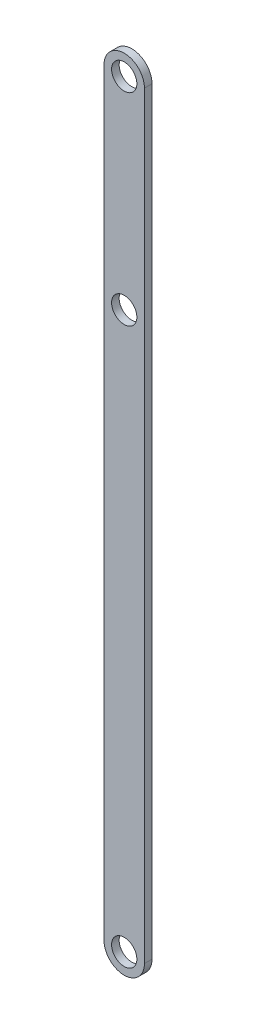
ISO-10303-21;
HEADER;
FILE_DESCRIPTION(('STEP AP214'),'2;1');
FILE_NAME('part.step','',(''),(''),'','','');
FILE_SCHEMA(('AUTOMOTIVE_DESIGN { 1 0 10303 214 1 1 1 1 }'));
ENDSEC;
DATA;
#1=APPLICATION_CONTEXT('core data for automotive mechanical design processes');
#2=APPLICATION_PROTOCOL_DEFINITION('international standard','automotive_design',2000,#1);
#3=PRODUCT_CONTEXT('',#1,'mechanical');
#4=PRODUCT('Part','Part','',(#3));
#5=PRODUCT_RELATED_PRODUCT_CATEGORY('part','',(#4));
#6=PRODUCT_DEFINITION_FORMATION('','',#4);
#7=PRODUCT_DEFINITION_CONTEXT('part definition',#1,'design');
#8=PRODUCT_DEFINITION('design','',#6,#7);
#9=PRODUCT_DEFINITION_SHAPE('','',#8);
#10=(LENGTH_UNIT() NAMED_UNIT(*) SI_UNIT(.MILLI.,.METRE.));
#11=(NAMED_UNIT(*) PLANE_ANGLE_UNIT() SI_UNIT($,.RADIAN.));
#12=(NAMED_UNIT(*) SI_UNIT($,.STERADIAN.) SOLID_ANGLE_UNIT());
#13=UNCERTAINTY_MEASURE_WITH_UNIT(LENGTH_MEASURE(1.E-05),#10,'distance_accuracy_value','');
#14=(GEOMETRIC_REPRESENTATION_CONTEXT(3) GLOBAL_UNCERTAINTY_ASSIGNED_CONTEXT((#13)) GLOBAL_UNIT_ASSIGNED_CONTEXT((#10,
#11,#12)) REPRESENTATION_CONTEXT('',''));
#15=CARTESIAN_POINT('',(0.,0.,0.));
#16=DIRECTION('',(0.,0.,1.));
#17=DIRECTION('',(1.,0.,0.));
#18=AXIS2_PLACEMENT_3D('',#15,#16,#17);
#19=CARTESIAN_POINT('',(0.,-15.,0.3));
#20=DIRECTION('',(0.,0.,1.));
#21=DIRECTION('',(1.,0.,0.));
#22=AXIS2_PLACEMENT_3D('',#19,#20,#21);
#23=PLANE('',#22);
#24=CARTESIAN_POINT('',(0.,-15.,0.3));
#25=DIRECTION('',(0.,0.,1.));
#26=DIRECTION('',(1.,0.,0.));
#27=AXIS2_PLACEMENT_3D('',#24,#25,#26);
#28=CIRCLE('',#27,0.5);
#29=CARTESIAN_POINT('',(0.5,-15.,0.3));
#30=VERTEX_POINT('',#29);
#31=EDGE_CURVE('E115',#30,#30,#28,.T.);
#32=ORIENTED_EDGE('',*,*,#31,.F.);
#33=EDGE_LOOP('',(#32));
#34=FACE_BOUND('',#33,.T.);
#35=CARTESIAN_POINT('',(0.,-15.,0.3));
#36=DIRECTION('',(0.,0.,1.));
#37=DIRECTION('',(1.,0.,0.));
#38=AXIS2_PLACEMENT_3D('',#35,#36,#37);
#39=CIRCLE('',#38,0.800000000000006);
#40=CARTESIAN_POINT('',(-0.800000000000006,-15.,0.3));
#41=VERTEX_POINT('',#40);
#42=CARTESIAN_POINT('',(0.800000000000006,-15.,0.3));
#43=VERTEX_POINT('',#42);
#44=EDGE_CURVE('E85',#41,#43,#39,.T.);
#45=ORIENTED_EDGE('',*,*,#44,.T.);
#46=DIRECTION('',(0.,1.,0.));
#47=VECTOR('',#46,1.);
#48=CARTESIAN_POINT('',(0.800000000000006,-15.,0.3));
#49=LINE('',#48,#47);
#50=CARTESIAN_POINT('',(0.8,15.,0.3));
#51=VERTEX_POINT('',#50);
#52=EDGE_CURVE('E80',#43,#51,#49,.T.);
#53=ORIENTED_EDGE('',*,*,#52,.T.);
#54=CARTESIAN_POINT('',(0.,15.,0.3));
#55=DIRECTION('',(0.,0.,1.));
#56=DIRECTION('',(1.,0.,0.));
#57=AXIS2_PLACEMENT_3D('',#54,#55,#56);
#58=CIRCLE('',#57,0.800000000000006);
#59=CARTESIAN_POINT('',(-0.800000000000011,15.,0.3));
#60=VERTEX_POINT('',#59);
#61=EDGE_CURVE('E83',#51,#60,#58,.T.);
#62=ORIENTED_EDGE('',*,*,#61,.T.);
#63=DIRECTION('',(0.,-1.,0.));
#64=VECTOR('',#63,1.);
#65=CARTESIAN_POINT('',(-0.800000000000006,-15.,0.3));
#66=LINE('',#65,#64);
#67=EDGE_CURVE('E50',#60,#41,#66,.T.);
#68=ORIENTED_EDGE('',*,*,#67,.T.);
#69=EDGE_LOOP('',(#45,#53,#62,#68));
#70=FACE_BOUND('',#69,.T.);
#71=CARTESIAN_POINT('',(0.,15.,0.3));
#72=DIRECTION('',(0.,0.,1.));
#73=DIRECTION('',(1.,0.,0.));
#74=AXIS2_PLACEMENT_3D('',#71,#72,#73);
#75=CIRCLE('',#74,0.5);
#76=CARTESIAN_POINT('',(0.499999999999995,15.,0.3));
#77=VERTEX_POINT('',#76);
#78=EDGE_CURVE('E100',#77,#77,#75,.T.);
#79=ORIENTED_EDGE('',*,*,#78,.F.);
#80=EDGE_LOOP('',(#79));
#81=FACE_BOUND('',#80,.T.);
#82=CARTESIAN_POINT('',(0.,7.,0.3));
#83=DIRECTION('',(0.,0.,1.));
#84=DIRECTION('',(1.,0.,0.));
#85=AXIS2_PLACEMENT_3D('',#82,#83,#84);
#86=CIRCLE('',#85,0.5);
#87=CARTESIAN_POINT('',(0.5,7.,0.3));
#88=VERTEX_POINT('',#87);
#89=EDGE_CURVE('E121',#88,#88,#86,.T.);
#90=ORIENTED_EDGE('',*,*,#89,.F.);
#91=EDGE_LOOP('',(#90));
#92=FACE_BOUND('',#91,.T.);
#93=ADVANCED_FACE('F33',(#34,#70,#81,#92),#23,.T.);
#94=CARTESIAN_POINT('',(0.,-15.,0.));
#95=DIRECTION('',(0.,0.,1.));
#96=DIRECTION('',(1.,0.,0.));
#97=AXIS2_PLACEMENT_3D('',#94,#95,#96);
#98=PLANE('',#97);
#99=CARTESIAN_POINT('',(0.,-15.,0.));
#100=DIRECTION('',(0.,0.,1.));
#101=DIRECTION('',(1.,0.,0.));
#102=AXIS2_PLACEMENT_3D('',#99,#100,#101);
#103=CIRCLE('',#102,0.800000000000006);
#104=CARTESIAN_POINT('',(-0.800000000000006,-15.,0.));
#105=VERTEX_POINT('',#104);
#106=CARTESIAN_POINT('',(0.800000000000006,-15.,0.));
#107=VERTEX_POINT('',#106);
#108=EDGE_CURVE('E97',#105,#107,#103,.T.);
#109=ORIENTED_EDGE('',*,*,#108,.F.);
#110=DIRECTION('',(0.,-1.,0.));
#111=VECTOR('',#110,1.);
#112=CARTESIAN_POINT('',(-0.800000000000006,-15.,0.));
#113=LINE('',#112,#111);
#114=CARTESIAN_POINT('',(-0.800000000000011,15.,0.));
#115=VERTEX_POINT('',#114);
#116=EDGE_CURVE('E73',#115,#105,#113,.T.);
#117=ORIENTED_EDGE('',*,*,#116,.F.);
#118=CARTESIAN_POINT('',(0.,15.,0.));
#119=DIRECTION('',(0.,0.,1.));
#120=DIRECTION('',(1.,0.,0.));
#121=AXIS2_PLACEMENT_3D('',#118,#119,#120);
#122=CIRCLE('',#121,0.800000000000006);
#123=CARTESIAN_POINT('',(0.8,15.,0.));
#124=VERTEX_POINT('',#123);
#125=EDGE_CURVE('E67',#124,#115,#122,.T.);
#126=ORIENTED_EDGE('',*,*,#125,.F.);
#127=DIRECTION('',(0.,1.,0.));
#128=VECTOR('',#127,1.);
#129=CARTESIAN_POINT('',(0.800000000000006,-15.,0.));
#130=LINE('',#129,#128);
#131=EDGE_CURVE('E89',#107,#124,#130,.T.);
#132=ORIENTED_EDGE('',*,*,#131,.F.);
#133=EDGE_LOOP('',(#109,#117,#126,#132));
#134=FACE_BOUND('',#133,.T.);
#135=CARTESIAN_POINT('',(0.,15.,0.));
#136=DIRECTION('',(0.,0.,1.));
#137=DIRECTION('',(1.,0.,0.));
#138=AXIS2_PLACEMENT_3D('',#135,#136,#137);
#139=CIRCLE('',#138,0.5);
#140=CARTESIAN_POINT('',(0.499999999999995,15.,0.));
#141=VERTEX_POINT('',#140);
#142=EDGE_CURVE('E112',#141,#141,#139,.T.);
#143=ORIENTED_EDGE('',*,*,#142,.T.);
#144=EDGE_LOOP('',(#143));
#145=FACE_BOUND('',#144,.T.);
#146=CARTESIAN_POINT('',(0.,-15.,0.));
#147=DIRECTION('',(0.,0.,1.));
#148=DIRECTION('',(1.,0.,0.));
#149=AXIS2_PLACEMENT_3D('',#146,#147,#148);
#150=CIRCLE('',#149,0.5);
#151=CARTESIAN_POINT('',(0.5,-15.,0.));
#152=VERTEX_POINT('',#151);
#153=EDGE_CURVE('E118',#152,#152,#150,.T.);
#154=ORIENTED_EDGE('',*,*,#153,.T.);
#155=EDGE_LOOP('',(#154));
#156=FACE_BOUND('',#155,.T.);
#157=CARTESIAN_POINT('',(0.,7.,0.));
#158=DIRECTION('',(0.,0.,1.));
#159=DIRECTION('',(1.,0.,0.));
#160=AXIS2_PLACEMENT_3D('',#157,#158,#159);
#161=CIRCLE('',#160,0.5);
#162=CARTESIAN_POINT('',(0.5,7.,0.));
#163=VERTEX_POINT('',#162);
#164=EDGE_CURVE('E124',#163,#163,#161,.T.);
#165=ORIENTED_EDGE('',*,*,#164,.T.);
#166=EDGE_LOOP('',(#165));
#167=FACE_BOUND('',#166,.T.);
#168=ADVANCED_FACE('F108',(#134,#145,#156,#167),#98,.F.);
#169=CARTESIAN_POINT('',(0.,-15.,0.3));
#170=DIRECTION('',(0.,0.,-1.));
#171=DIRECTION('',(-1.,0.,0.));
#172=AXIS2_PLACEMENT_3D('',#169,#170,#171);
#173=CYLINDRICAL_SURFACE('',#172,0.800000000000006);
#174=ORIENTED_EDGE('',*,*,#108,.T.);
#175=DIRECTION('',(0.,0.,-1.));
#176=VECTOR('',#175,1.);
#177=CARTESIAN_POINT('',(0.800000000000006,-15.,0.3));
#178=LINE('',#177,#176);
#179=EDGE_CURVE('E11',#43,#107,#178,.T.);
#180=ORIENTED_EDGE('',*,*,#179,.F.);
#181=ORIENTED_EDGE('',*,*,#44,.F.);
#182=DIRECTION('',(0.,0.,-1.));
#183=VECTOR('',#182,1.);
#184=CARTESIAN_POINT('',(-0.800000000000006,-15.,0.3));
#185=LINE('',#184,#183);
#186=EDGE_CURVE('E93',#41,#105,#185,.T.);
#187=ORIENTED_EDGE('',*,*,#186,.T.);
#188=EDGE_LOOP('',(#174,#180,#181,#187));
#189=FACE_BOUND('',#188,.T.);
#190=ADVANCED_FACE('F35',(#189),#173,.T.);
#191=CARTESIAN_POINT('',(0.800000000000006,-15.,0.3));
#192=DIRECTION('',(-1.,0.,0.));
#193=DIRECTION('',(0.,-1.,0.));
#194=AXIS2_PLACEMENT_3D('',#191,#192,#193);
#195=PLANE('',#194);
#196=ORIENTED_EDGE('',*,*,#131,.T.);
#197=DIRECTION('',(0.,0.,-1.));
#198=VECTOR('',#197,1.);
#199=CARTESIAN_POINT('',(0.8,15.,0.3));
#200=LINE('',#199,#198);
#201=EDGE_CURVE('E42',#51,#124,#200,.T.);
#202=ORIENTED_EDGE('',*,*,#201,.F.);
#203=ORIENTED_EDGE('',*,*,#52,.F.);
#204=ORIENTED_EDGE('',*,*,#179,.T.);
#205=EDGE_LOOP('',(#196,#202,#203,#204));
#206=FACE_BOUND('',#205,.T.);
#207=ADVANCED_FACE('F88',(#206),#195,.F.);
#208=CARTESIAN_POINT('',(0.,15.,0.3));
#209=DIRECTION('',(0.,0.,-1.));
#210=DIRECTION('',(-1.,0.,0.));
#211=AXIS2_PLACEMENT_3D('',#208,#209,#210);
#212=CYLINDRICAL_SURFACE('',#211,0.800000000000006);
#213=ORIENTED_EDGE('',*,*,#125,.T.);
#214=DIRECTION('',(0.,0.,-1.));
#215=VECTOR('',#214,1.);
#216=CARTESIAN_POINT('',(-0.800000000000011,15.,0.3));
#217=LINE('',#216,#215);
#218=EDGE_CURVE('E90',#60,#115,#217,.T.);
#219=ORIENTED_EDGE('',*,*,#218,.F.);
#220=ORIENTED_EDGE('',*,*,#61,.F.);
#221=ORIENTED_EDGE('',*,*,#201,.T.);
#222=EDGE_LOOP('',(#213,#219,#220,#221));
#223=FACE_BOUND('',#222,.T.);
#224=ADVANCED_FACE('F91',(#223),#212,.T.);
#225=CARTESIAN_POINT('',(-0.800000000000006,-15.,0.3));
#226=DIRECTION('',(1.,0.,0.));
#227=DIRECTION('',(0.,1.,0.));
#228=AXIS2_PLACEMENT_3D('',#225,#226,#227);
#229=PLANE('',#228);
#230=ORIENTED_EDGE('',*,*,#116,.T.);
#231=ORIENTED_EDGE('',*,*,#186,.F.);
#232=ORIENTED_EDGE('',*,*,#67,.F.);
#233=ORIENTED_EDGE('',*,*,#218,.T.);
#234=EDGE_LOOP('',(#230,#231,#232,#233));
#235=FACE_BOUND('',#234,.T.);
#236=ADVANCED_FACE('F105',(#235),#229,.F.);
#237=CARTESIAN_POINT('',(0.,15.,0.3));
#238=DIRECTION('',(0.,0.,-1.));
#239=DIRECTION('',(-1.,0.,0.));
#240=AXIS2_PLACEMENT_3D('',#237,#238,#239);
#241=CYLINDRICAL_SURFACE('',#240,0.5);
#242=ORIENTED_EDGE('',*,*,#78,.T.);
#243=EDGE_LOOP('',(#242));
#244=FACE_BOUND('',#243,.T.);
#245=ORIENTED_EDGE('',*,*,#142,.F.);
#246=EDGE_LOOP('',(#245));
#247=FACE_BOUND('',#246,.T.);
#248=ADVANCED_FACE('F142',(#244,#247),#241,.F.);
#249=CARTESIAN_POINT('',(0.,-15.,0.3));
#250=DIRECTION('',(0.,0.,-1.));
#251=DIRECTION('',(-1.,0.,0.));
#252=AXIS2_PLACEMENT_3D('',#249,#250,#251);
#253=CYLINDRICAL_SURFACE('',#252,0.5);
#254=ORIENTED_EDGE('',*,*,#31,.T.);
#255=EDGE_LOOP('',(#254));
#256=FACE_BOUND('',#255,.T.);
#257=ORIENTED_EDGE('',*,*,#153,.F.);
#258=EDGE_LOOP('',(#257));
#259=FACE_BOUND('',#258,.T.);
#260=ADVANCED_FACE('F188',(#256,#259),#253,.F.);
#261=CARTESIAN_POINT('',(0.,7.,0.3));
#262=DIRECTION('',(0.,0.,-1.));
#263=DIRECTION('',(-1.,0.,0.));
#264=AXIS2_PLACEMENT_3D('',#261,#262,#263);
#265=CYLINDRICAL_SURFACE('',#264,0.5);
#266=ORIENTED_EDGE('',*,*,#89,.T.);
#267=EDGE_LOOP('',(#266));
#268=FACE_BOUND('',#267,.T.);
#269=ORIENTED_EDGE('',*,*,#164,.F.);
#270=EDGE_LOOP('',(#269));
#271=FACE_BOUND('',#270,.T.);
#272=ADVANCED_FACE('F130',(#268,#271),#265,.F.);
#273=CLOSED_SHELL('',(#93,#168,#190,#207,#224,#236,#248,#260,#272));
#274=MANIFOLD_SOLID_BREP('B2',#273);
#275=ADVANCED_BREP_SHAPE_REPRESENTATION('',(#18,#274),#14);
#276=SHAPE_DEFINITION_REPRESENTATION(#9,#275);
ENDSEC;
END-ISO-10303-21;
